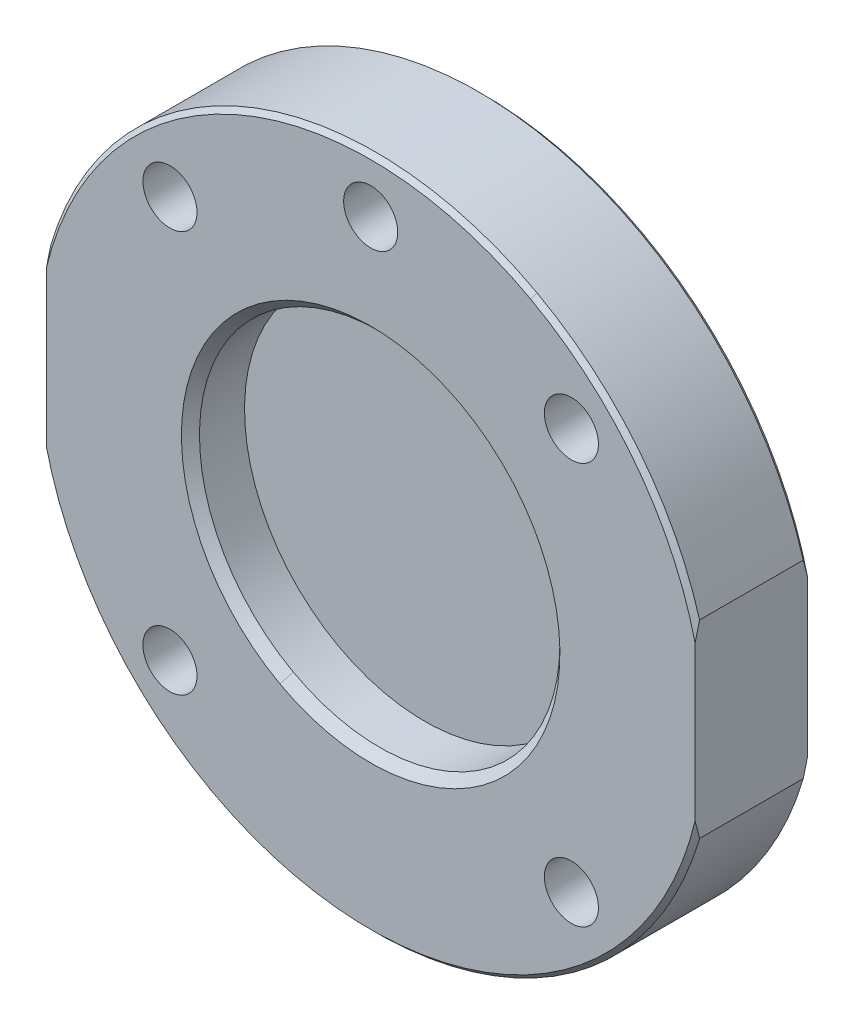
ISO-10303-21;
HEADER;
FILE_DESCRIPTION(('STEP AP214'),'2;1');
FILE_NAME('part.step','',(''),(''),'','','');
FILE_SCHEMA(('AUTOMOTIVE_DESIGN { 1 0 10303 214 1 1 1 1 }'));
ENDSEC;
DATA;
#1=APPLICATION_CONTEXT('core data for automotive mechanical design processes');
#2=APPLICATION_PROTOCOL_DEFINITION('international standard','automotive_design',2000,#1);
#3=PRODUCT_CONTEXT('',#1,'mechanical');
#4=PRODUCT('Part','Part','',(#3));
#5=PRODUCT_RELATED_PRODUCT_CATEGORY('part','',(#4));
#6=PRODUCT_DEFINITION_FORMATION('','',#4);
#7=PRODUCT_DEFINITION_CONTEXT('part definition',#1,'design');
#8=PRODUCT_DEFINITION('design','',#6,#7);
#9=PRODUCT_DEFINITION_SHAPE('','',#8);
#10=(LENGTH_UNIT() NAMED_UNIT(*) SI_UNIT(.MILLI.,.METRE.));
#11=(NAMED_UNIT(*) PLANE_ANGLE_UNIT() SI_UNIT($,.RADIAN.));
#12=(NAMED_UNIT(*) SI_UNIT($,.STERADIAN.) SOLID_ANGLE_UNIT());
#13=UNCERTAINTY_MEASURE_WITH_UNIT(LENGTH_MEASURE(1.E-05),#10,'distance_accuracy_value','');
#14=(GEOMETRIC_REPRESENTATION_CONTEXT(3) GLOBAL_UNCERTAINTY_ASSIGNED_CONTEXT((#13)) GLOBAL_UNIT_ASSIGNED_CONTEXT((#10,
#11,#12)) REPRESENTATION_CONTEXT('',''));
#15=CARTESIAN_POINT('',(0.,0.,0.));
#16=DIRECTION('',(0.,0.,1.));
#17=DIRECTION('',(1.,0.,0.));
#18=AXIS2_PLACEMENT_3D('',#15,#16,#17);
#19=CARTESIAN_POINT('',(-1.26431568645E-11,187.5,2135.));
#20=DIRECTION('',(0.,0.,-1.));
#21=DIRECTION('',(0.,1.,0.));
#22=AXIS2_PLACEMENT_3D('',#19,#20,#21);
#23=PLANE('',#22);
#24=CARTESIAN_POINT('',(-1.27996257736669E-11,150.,2135.));
#25=DIRECTION('',(0.,0.,-1.));
#26=DIRECTION('',(0.,1.,0.));
#27=AXIS2_PLACEMENT_3D('',#24,#25,#26);
#28=CIRCLE('',#27,37.0000000000614);
#29=CARTESIAN_POINT('',(-17.7387449868929,117.529445242013,2135.));
#30=VERTEX_POINT('',#29);
#31=CARTESIAN_POINT('',(-36.,141.455996254382,2135.));
#32=VERTEX_POINT('',#31);
#33=EDGE_CURVE('E236',#30,#32,#28,.T.);
#34=ORIENTED_EDGE('',*,*,#33,.F.);
#35=CARTESIAN_POINT('',(-1.28069309946663E-11,150.,2135.00000000005));
#36=DIRECTION('',(0.,0.,-1.));
#37=DIRECTION('',(-1.,0.,0.));
#38=AXIS2_PLACEMENT_3D('',#35,#36,#37);
#39=CIRCLE('',#38,36.9999999999653);
#40=CARTESIAN_POINT('',(36.,141.455996254935,2135.00000000006));
#41=VERTEX_POINT('',#40);
#42=EDGE_CURVE('E341',#41,#30,#39,.T.);
#43=ORIENTED_EDGE('',*,*,#42,.F.);
#44=DIRECTION('',(0.,1.,0.));
#45=VECTOR('',#44,1.);
#46=CARTESIAN_POINT('',(36.,203.876224518,2135.));
#47=LINE('',#46,#45);
#48=CARTESIAN_POINT('',(36.,158.544003745354,2135.));
#49=VERTEX_POINT('',#48);
#50=EDGE_CURVE('E235',#49,#41,#47,.F.);
#51=ORIENTED_EDGE('',*,*,#50,.F.);
#52=CARTESIAN_POINT('',(-1.2806930994673E-11,150.,2135.));
#53=DIRECTION('',(0.,0.,-1.));
#54=DIRECTION('',(-1.,0.,0.));
#55=AXIS2_PLACEMENT_3D('',#52,#53,#54);
#56=CIRCLE('',#55,37.0000000000291);
#57=CARTESIAN_POINT('',(17.7387449282676,182.470554789967,2135.00000000008));
#58=VERTEX_POINT('',#57);
#59=EDGE_CURVE('E96',#58,#49,#56,.T.);
#60=ORIENTED_EDGE('',*,*,#59,.F.);
#61=CARTESIAN_POINT('',(-1.27996257736651E-11,150.,2135.0000000001));
#62=DIRECTION('',(0.,0.,-1.));
#63=DIRECTION('',(0.,1.,0.));
#64=AXIS2_PLACEMENT_3D('',#61,#62,#63);
#65=CIRCLE('',#64,36.999999999946);
#66=CARTESIAN_POINT('',(-36.,158.544003745082,2135.00000000011));
#67=VERTEX_POINT('',#66);
#68=EDGE_CURVE('E332',#67,#58,#65,.T.);
#69=ORIENTED_EDGE('',*,*,#68,.F.);
#70=DIRECTION('',(0.,-1.,0.));
#71=VECTOR('',#70,1.);
#72=CARTESIAN_POINT('',(-36.,96.1237754822,2135.));
#73=LINE('',#72,#71);
#74=EDGE_CURVE('E192',#32,#67,#73,.F.);
#75=ORIENTED_EDGE('',*,*,#74,.F.);
#76=EDGE_LOOP('',(#34,#43,#51,#60,#69,#75));
#77=FACE_BOUND('',#76,.T.);
#78=CARTESIAN_POINT('',(-1.28109328700898E-11,150.,2135.00000000016));
#79=DIRECTION('',(0.,0.,1.));
#80=DIRECTION('',(1.,0.,0.));
#81=AXIS2_PLACEMENT_3D('',#78,#79,#80);
#82=CIRCLE('',#81,21.0000000000281);
#83=CARTESIAN_POINT('',(-10.0679370077922,131.570766581014,2135.0000000001));
#84=VERTEX_POINT('',#83);
#85=CARTESIAN_POINT('',(10.0679363106729,168.429233799812,2135.00000000016));
#86=VERTEX_POINT('',#85);
#87=EDGE_CURVE('E337',#84,#86,#82,.T.);
#88=ORIENTED_EDGE('',*,*,#87,.F.);
#89=CARTESIAN_POINT('',(-1.28076802635725E-11,150.,2135.0000000001));
#90=DIRECTION('',(0.,0.,1.));
#91=DIRECTION('',(1.,0.,0.));
#92=AXIS2_PLACEMENT_3D('',#89,#90,#91);
#93=CIRCLE('',#92,21.000000000097);
#94=EDGE_CURVE('E334',#86,#84,#93,.T.);
#95=ORIENTED_EDGE('',*,*,#94,.F.);
#96=EDGE_LOOP('',(#88,#95));
#97=FACE_BOUND('',#96,.T.);
#98=CARTESIAN_POINT('',(5.38149255679771E-12,181.5,2135.));
#99=DIRECTION('',(0.,0.,1.));
#100=DIRECTION('',(1.,0.,0.));
#101=AXIS2_PLACEMENT_3D('',#98,#99,#100);
#102=CIRCLE('',#101,3.);
#103=CARTESIAN_POINT('',(3.00000000000538,181.5,2135.));
#104=VERTEX_POINT('',#103);
#105=EDGE_CURVE('E350',#104,#104,#102,.T.);
#106=ORIENTED_EDGE('',*,*,#105,.F.);
#107=EDGE_LOOP('',(#106));
#108=FACE_BOUND('',#107,.T.);
#109=CARTESIAN_POINT('',(-22.2738636073891,172.273863607376,2135.));
#110=DIRECTION('',(0.,0.,1.));
#111=DIRECTION('',(1.,0.,0.));
#112=AXIS2_PLACEMENT_3D('',#109,#110,#111);
#113=CIRCLE('',#112,2.99999999999989);
#114=CARTESIAN_POINT('',(-19.2738636073892,172.273863607376,2135.));
#115=VERTEX_POINT('',#114);
#116=EDGE_CURVE('E354',#115,#115,#113,.T.);
#117=ORIENTED_EDGE('',*,*,#116,.F.);
#118=EDGE_LOOP('',(#117));
#119=FACE_BOUND('',#118,.T.);
#120=CARTESIAN_POINT('',(22.2738636073634,172.273863607376,2135.));
#121=DIRECTION('',(0.,0.,1.));
#122=DIRECTION('',(0.,-1.,0.));
#123=AXIS2_PLACEMENT_3D('',#120,#121,#122);
#124=CIRCLE('',#123,2.99999999999989);
#125=CARTESIAN_POINT('',(22.2738636073634,169.273863607377,2135.));
#126=VERTEX_POINT('',#125);
#127=EDGE_CURVE('E358',#126,#126,#124,.T.);
#128=ORIENTED_EDGE('',*,*,#127,.F.);
#129=EDGE_LOOP('',(#128));
#130=FACE_BOUND('',#129,.T.);
#131=CARTESIAN_POINT('',(22.2738636073635,127.726136392624,2135.));
#132=DIRECTION('',(0.,0.,1.));
#133=DIRECTION('',(0.,-1.,0.));
#134=AXIS2_PLACEMENT_3D('',#131,#132,#133);
#135=CIRCLE('',#134,2.99999999999989);
#136=CARTESIAN_POINT('',(22.2738636073635,124.726136392624,2135.));
#137=VERTEX_POINT('',#136);
#138=EDGE_CURVE('E371',#137,#137,#135,.T.);
#139=ORIENTED_EDGE('',*,*,#138,.F.);
#140=EDGE_LOOP('',(#139));
#141=FACE_BOUND('',#140,.T.);
#142=CARTESIAN_POINT('',(-22.2738636073892,127.726136392624,2135.));
#143=DIRECTION('',(0.,0.,1.));
#144=DIRECTION('',(0.,-1.,0.));
#145=AXIS2_PLACEMENT_3D('',#142,#143,#144);
#146=CIRCLE('',#145,2.99999999999989);
#147=CARTESIAN_POINT('',(-22.2738636073892,124.726136392624,2135.));
#148=VERTEX_POINT('',#147);
#149=EDGE_CURVE('E410',#148,#148,#146,.T.);
#150=ORIENTED_EDGE('',*,*,#149,.F.);
#151=EDGE_LOOP('',(#150));
#152=FACE_BOUND('',#151,.T.);
#153=ADVANCED_FACE('F17',(#77,#97,#108,#119,#130,#141,#152),#23,.F.);
#154=CARTESIAN_POINT('',(-1.27156329849E-11,170.,2129.));
#155=DIRECTION('',(0.,0.,-1.));
#156=DIRECTION('',(0.,1.,0.));
#157=AXIS2_PLACEMENT_3D('',#154,#155,#156);
#158=PLANE('',#157);
#159=CARTESIAN_POINT('',(-1.28025326172467E-11,150.,2129.));
#160=DIRECTION('',(0.,0.,-1.));
#161=DIRECTION('',(0.,1.,0.));
#162=AXIS2_PLACEMENT_3D('',#159,#160,#161);
#163=CIRCLE('',#162,20.);
#164=CARTESIAN_POINT('',(-1.28025326172467E-11,170.,2129.));
#165=VERTEX_POINT('',#164);
#166=EDGE_CURVE('E272',#165,#165,#163,.F.);
#167=ORIENTED_EDGE('',*,*,#166,.T.);
#168=EDGE_LOOP('',(#167));
#169=FACE_BOUND('',#168,.T.);
#170=ADVANCED_FACE('F19',(#169),#158,.F.);
#171=CARTESIAN_POINT('',(-1.28031627686E-11,150.,2128.75));
#172=DIRECTION('',(0.,0.,-1.));
#173=DIRECTION('',(0.,1.,0.));
#174=AXIS2_PLACEMENT_3D('',#171,#172,#173);
#175=CYLINDRICAL_SURFACE('',#174,20.);
#176=ORIENTED_EDGE('',*,*,#166,.F.);
#177=EDGE_LOOP('',(#176));
#178=FACE_BOUND('',#177,.T.);
#179=CARTESIAN_POINT('',(-1.27997918816526E-11,150.,2134.00000000007));
#180=DIRECTION('',(0.,0.,1.));
#181=DIRECTION('',(-0.150254927181628,-0.988647286375502,0.));
#182=AXIS2_PLACEMENT_3D('',#179,#180,#181);
#183=CIRCLE('',#182,20.0000000000519);
#184=CARTESIAN_POINT('',(9.58851077201447,167.551651237872,2134.00000000006));
#185=VERTEX_POINT('',#184);
#186=CARTESIAN_POINT('',(-9.58851077203576,132.448348762118,2134.00000000007));
#187=VERTEX_POINT('',#186);
#188=EDGE_CURVE('E256',#185,#187,#183,.T.);
#189=ORIENTED_EDGE('',*,*,#188,.T.);
#190=CARTESIAN_POINT('',(-1.27997918816294E-11,150.,2134.00000000013));
#191=DIRECTION('',(0.,0.,1.));
#192=DIRECTION('',(0.479425538605568,0.877582561889627,0.));
#193=AXIS2_PLACEMENT_3D('',#190,#191,#192);
#194=CIRCLE('',#193,20.0000000000421);
#195=EDGE_CURVE('E268',#187,#185,#194,.T.);
#196=ORIENTED_EDGE('',*,*,#195,.T.);
#197=EDGE_LOOP('',(#189,#196));
#198=FACE_BOUND('',#197,.T.);
#199=ADVANCED_FACE('F466',(#178,#198),#175,.F.);
#200=CARTESIAN_POINT('',(-1.28109328700887E-11,150.,2135.0000000001));
#201=DIRECTION('',(0.,0.,1.));
#202=DIRECTION('',(1.,0.,0.));
#203=AXIS2_PLACEMENT_3D('',#200,#201,#202);
#204=CONICAL_SURFACE('',#203,20.9999999999712,0.785398163387295);
#205=ORIENTED_EDGE('',*,*,#195,.F.);
#206=CARTESIAN_POINT('',(-9.58851077180505,132.448348762259,2133.99999999967));
#207=CARTESIAN_POINT('',(-9.60848686358083,132.41178283731,2134.04166666636));
#208=CARTESIAN_POINT('',(-9.62846295552438,132.375216912441,2134.08333333303));
#209=CARTESIAN_POINT('',(-9.66841513977023,132.302085062857,2134.1666666664));
#210=CARTESIAN_POINT('',(-9.68839123207254,132.265519138141,2134.20833333309));
#211=CARTESIAN_POINT('',(-9.72834341703227,132.192387288905,2134.29166666647));
#212=CARTESIAN_POINT('',(-9.74831950968968,132.155821364385,2134.33333333317));
#213=CARTESIAN_POINT('',(-9.78827169532161,132.082689515563,2134.41666666652));
#214=CARTESIAN_POINT('',(-9.80824778829613,132.046123591262,2134.45833333318));
#215=CARTESIAN_POINT('',(-9.84819997462057,131.972991742813,2134.54166666653));
#216=CARTESIAN_POINT('',(-9.8681760679705,131.936425818666,2134.58333333321));
#217=CARTESIAN_POINT('',(-9.90812825499771,131.863293970586,2134.66666666661));
#218=CARTESIAN_POINT('',(-9.928104348675,131.826728046653,2134.70833333331));
#219=CARTESIAN_POINT('',(-9.96805653638615,131.753596198946,2134.7916666667));
#220=CARTESIAN_POINT('',(-9.98803263042,131.717030275173,2134.83333333339));
#221=CARTESIAN_POINT('',(-10.0279848188205,131.64389842785,2134.91666666674));
#222=CARTESIAN_POINT('',(-10.0479609131872,131.607332504302,2134.95833333341));
#223=CARTESIAN_POINT('',(-10.0679370077242,131.570766580869,2135.0000000001));
#224=B_SPLINE_CURVE_WITH_KNOTS('',3,(#206,#207,#208,#209,#210,#211,#212,#213,#214,#215,#216,
#217,#218,#219,#220,#221,#222,#223),.UNSPECIFIED.,.F.,.F.,(4,2,2,2,2,2,2,2,4),(0.,
0.17677669530433,0.353553390728328,0.530330086153817,0.707106781416434,0.883883476841935,
1.06066017222619,1.23743686765018,1.41421356295451),.UNSPECIFIED.);
#225=EDGE_CURVE('E255',#187,#84,#224,.T.);
#226=ORIENTED_EDGE('',*,*,#225,.T.);
#227=ORIENTED_EDGE('',*,*,#87,.T.);
#228=DIRECTION('',(-0.339005049417269,-0.620544580565485,-0.707106781186831));
#229=VECTOR('',#228,1.);
#230=CARTESIAN_POINT('',(238219.838172141,436208.48884851,499000.));
#231=LINE('',#230,#229);
#232=EDGE_CURVE('E260',#86,#185,#231,.T.);
#233=ORIENTED_EDGE('',*,*,#232,.T.);
#234=EDGE_LOOP('',(#205,#226,#227,#233));
#235=FACE_BOUND('',#234,.T.);
#236=ADVANCED_FACE('F472',(#235),#204,.F.);
#237=CARTESIAN_POINT('',(-1.28076802635713E-11,150.,2135.));
#238=DIRECTION('',(0.,0.,1.));
#239=DIRECTION('',(1.,0.,0.));
#240=AXIS2_PLACEMENT_3D('',#237,#238,#239);
#241=CONICAL_SURFACE('',#240,20.9999999999824,0.785398163402658);
#242=ORIENTED_EDGE('',*,*,#188,.F.);
#243=ORIENTED_EDGE('',*,*,#232,.F.);
#244=ORIENTED_EDGE('',*,*,#94,.T.);
#245=ORIENTED_EDGE('',*,*,#225,.F.);
#246=EDGE_LOOP('',(#242,#243,#244,#245));
#247=FACE_BOUND('',#246,.T.);
#248=ADVANCED_FACE('F242',(#247),#241,.F.);
#249=CARTESIAN_POINT('',(-1.28213412109446E-11,150.,2134.49999999989));
#250=DIRECTION('',(0.,0.,-1.));
#251=DIRECTION('',(-1.,0.,0.));
#252=AXIS2_PLACEMENT_3D('',#249,#250,#251);
#253=CONICAL_SURFACE('',#252,37.5000000000957,0.785398163368873);
#254=CARTESIAN_POINT('',(-1.27886692874751E-11,150.,2134.5));
#255=DIRECTION('',(0.,0.,-1.));
#256=DIRECTION('',(0.,1.,0.));
#257=AXIS2_PLACEMENT_3D('',#254,#255,#256);
#258=CIRCLE('',#257,37.5);
#259=CARTESIAN_POINT('',(36.,139.500000014021,2134.5000000039));
#260=VERTEX_POINT('',#259);
#261=CARTESIAN_POINT('',(-17.9784576976579,117.090653929077,2134.5));
#262=VERTEX_POINT('',#261);
#263=EDGE_CURVE('E314',#260,#262,#258,.T.);
#264=ORIENTED_EDGE('',*,*,#263,.F.);
#265=CARTESIAN_POINT('',(35.9999999999904,141.455996254986,2135.00000000006));
#266=CARTESIAN_POINT('',(35.9999999999963,141.292043221371,2134.96214030547));
#267=CARTESIAN_POINT('',(35.9999999999988,141.128316864479,2134.92330095197));
#268=CARTESIAN_POINT('',(36.0000000000006,140.801352830876,2134.84370882591));
#269=CARTESIAN_POINT('',(36.,140.638115092221,2134.80295630786));
#270=CARTESIAN_POINT('',(35.9999999999994,140.312120610517,2134.71957381175));
#271=CARTESIAN_POINT('',(35.9999999999996,140.14936386601,2134.67694383938));
#272=CARTESIAN_POINT('',(35.9999999999999,139.824320782356,2134.58984194787));
#273=CARTESIAN_POINT('',(36.0000000000001,139.662034508484,2134.5453697851));
#274=CARTESIAN_POINT('',(36.,139.500000019499,2134.50000000543));
#275=B_SPLINE_CURVE_WITH_KNOTS('',3,(#265,#266,#267,#268,#269,#270,#271,#272,#273,#274),
.UNSPECIFIED.,.F.,.F.,(4,2,2,2,4),(0.,0.504798877370879,1.00953079000169,1.51426117073081,
2.01905851607456),.UNSPECIFIED.);
#276=EDGE_CURVE('E228',#41,#260,#275,.T.);
#277=ORIENTED_EDGE('',*,*,#276,.F.);
#278=ORIENTED_EDGE('',*,*,#42,.T.);
#279=CARTESIAN_POINT('',(-17.9784576976678,117.090653929236,2134.50000000017));
#280=CARTESIAN_POINT('',(-17.9684696680822,117.108936900613,2134.52083333349));
#281=CARTESIAN_POINT('',(-17.9584816385016,117.127219871989,2134.54166666681));
#282=CARTESIAN_POINT('',(-17.9385055793367,117.163785814736,2134.58333333345));
#283=CARTESIAN_POINT('',(-17.9285175497524,117.182068786109,2134.60416666677));
#284=CARTESIAN_POINT('',(-17.9085414905471,117.218634728886,2134.64583333344));
#285=CARTESIAN_POINT('',(-17.8985534609262,117.236917700291,2134.66666666679));
#286=CARTESIAN_POINT('',(-17.8785774017085,117.27348364305,2134.70833333349));
#287=CARTESIAN_POINT('',(-17.8685893721117,117.291766614404,2134.72916666684));
#288=CARTESIAN_POINT('',(-17.8486133128992,117.328332557127,2134.77083333348));
#289=CARTESIAN_POINT('',(-17.8386252832836,117.346615528495,2134.79166666677));
#290=CARTESIAN_POINT('',(-17.8186492240268,117.383181471249,2134.83333333341));
#291=CARTESIAN_POINT('',(-17.8086611943856,117.401464442636,2134.85416666677));
#292=CARTESIAN_POINT('',(-17.7886851351252,117.438030385349,2134.89583333345));
#293=CARTESIAN_POINT('',(-17.7786971055059,117.456313356676,2134.91666666678));
#294=CARTESIAN_POINT('',(-17.7587210462424,117.49287929936,2134.95833333343));
#295=CARTESIAN_POINT('',(-17.7487330165981,117.511162270717,2134.97916666675));
#296=CARTESIAN_POINT('',(-17.7387449869384,117.529445242096,2135.00000000005));
#297=B_SPLINE_CURVE_WITH_KNOTS('',3,(#279,#280,#281,#282,#283,#284,#285,#286,#287,#288,#289,
#290,#291,#292,#293,#294,#295,#296),.UNSPECIFIED.,.F.,.F.,(4,2,2,2,2,2,2,2,4),(0.,
0.0883883475912603,0.176776695180806,0.265165042933382,0.353553390563143,0.441941738112498,
0.530330085865078,0.61871843341501,0.70710678104588),.UNSPECIFIED.);
#298=EDGE_CURVE('E298',#262,#30,#297,.T.);
#299=ORIENTED_EDGE('',*,*,#298,.F.);
#300=EDGE_LOOP('',(#264,#277,#278,#299));
#301=FACE_BOUND('',#300,.T.);
#302=ADVANCED_FACE('F238',(#301),#253,.T.);
#303=CARTESIAN_POINT('',(-1.28213412109446E-11,150.,2134.50000000006));
#304=DIRECTION('',(0.,0.,-1.));
#305=DIRECTION('',(-1.,0.,0.));
#306=AXIS2_PLACEMENT_3D('',#303,#304,#305);
#307=CONICAL_SURFACE('',#306,37.4999999999687,0.78539816341238);
#308=ORIENTED_EDGE('',*,*,#59,.T.);
#309=CARTESIAN_POINT('',(35.9999999999313,160.500000014835,2134.49999999583));
#310=CARTESIAN_POINT('',(35.9999999999751,160.337965523028,2134.54536977644));
#311=CARTESIAN_POINT('',(35.9999999999932,160.175679246323,2134.58984194012));
#312=CARTESIAN_POINT('',(36.0000000000065,159.850636156982,2134.67694383336));
#313=CARTESIAN_POINT('',(36.0000000000017,159.687879409622,2134.71957380655));
#314=CARTESIAN_POINT('',(35.9999999999979,159.361884922195,2134.80295630426));
#315=CARTESIAN_POINT('',(35.9999999999988,159.19864718067,2134.84370882307));
#316=CARTESIAN_POINT('',(36.0000000000008,158.87168314131,2134.9233009506));
#317=CARTESIAN_POINT('',(36.0000000000018,158.70795678153,2134.9621403048));
#318=CARTESIAN_POINT('',(36.,158.544003745021,2135.00000000007));
#319=B_SPLINE_CURVE_WITH_KNOTS('',3,(#309,#310,#311,#312,#313,#314,#315,#316,#317,#318),
.UNSPECIFIED.,.F.,.F.,(4,2,2,2,4),(0.,0.504797354257133,1.00952774389577,1.51425966543595,
2.01905855172013),.UNSPECIFIED.);
#320=CARTESIAN_POINT('',(36.,160.500000007344,2134.49999999796));
#321=VERTEX_POINT('',#320);
#322=EDGE_CURVE('E206',#321,#49,#319,.T.);
#323=ORIENTED_EDGE('',*,*,#322,.F.);
#324=CARTESIAN_POINT('',(-1.28214638342133E-11,150.,2134.50000000006));
#325=DIRECTION('',(0.,0.,-1.));
#326=DIRECTION('',(0.479425538604406,0.877582561890262,0.));
#327=AXIS2_PLACEMENT_3D('',#324,#325,#326);
#328=CIRCLE('',#327,37.4999999999687);
#329=CARTESIAN_POINT('',(17.9784576976027,182.909346070941,2134.5));
#330=VERTEX_POINT('',#329);
#331=EDGE_CURVE('E102',#321,#330,#328,.F.);
#332=ORIENTED_EDGE('',*,*,#331,.T.);
#333=DIRECTION('',(-0.339005049419751,-0.62054458056411,0.707106781186848));
#334=VECTOR('',#333,1.);
#335=CARTESIAN_POINT('',(240274.656032335,439969.807707812,-499000.00000002));
#336=LINE('',#335,#334);
#337=EDGE_CURVE('E310',#58,#330,#336,.F.);
#338=ORIENTED_EDGE('',*,*,#337,.F.);
#339=EDGE_LOOP('',(#308,#323,#332,#338));
#340=FACE_BOUND('',#339,.T.);
#341=ADVANCED_FACE('F181',(#340),#307,.T.);
#342=CARTESIAN_POINT('',(-1.28074634231368E-11,150.,2134.50000000006));
#343=DIRECTION('',(0.,0.,-1.));
#344=DIRECTION('',(0.,1.,0.));
#345=AXIS2_PLACEMENT_3D('',#342,#343,#344);
#346=CONICAL_SURFACE('',#345,37.4999999999327,0.78539816333901);
#347=CARTESIAN_POINT('',(-1.27886692874751E-11,150.,2134.5));
#348=DIRECTION('',(0.,0.,-1.));
#349=DIRECTION('',(0.,1.,0.));
#350=AXIS2_PLACEMENT_3D('',#347,#348,#349);
#351=CIRCLE('',#350,37.5);
#352=CARTESIAN_POINT('',(-36.,160.499999910522,2134.50000002506));
#353=VERTEX_POINT('',#352);
#354=EDGE_CURVE('E299',#353,#330,#351,.T.);
#355=ORIENTED_EDGE('',*,*,#354,.F.);
#356=CARTESIAN_POINT('',(-35.9999999999806,158.544003745025,2135.00000000012));
#357=CARTESIAN_POINT('',(-35.9999999999928,158.707956769775,2134.96214030757));
#358=CARTESIAN_POINT('',(-35.9999999999979,158.871683117828,2134.92330095622));
#359=CARTESIAN_POINT('',(-36.0000000000016,159.198647133805,2134.84370883467));
#360=CARTESIAN_POINT('',(-36.0000000000003,159.361884863674,2134.80295631897));
#361=CARTESIAN_POINT('',(-35.9999999999992,159.687879327859,2134.71957382777));
#362=CARTESIAN_POINT('',(-35.9999999999994,159.850636063634,2134.67694385796));
#363=CARTESIAN_POINT('',(-36.,160.175679129875,2134.58984197175));
#364=CARTESIAN_POINT('',(-36.0000000000003,160.337965395065,2134.54536981173));
#365=CARTESIAN_POINT('',(-36.,160.499999875398,2134.5000000349));
#366=B_SPLINE_CURVE_WITH_KNOTS('',3,(#356,#357,#358,#359,#360,#361,#362,#363,#364,#365),
.UNSPECIFIED.,.F.,.F.,(4,2,2,2,4),(0.,0.504798850078364,1.00953073542713,1.51426108887424,
2.01905840692561),.UNSPECIFIED.);
#367=EDGE_CURVE('E185',#67,#353,#366,.T.);
#368=ORIENTED_EDGE('',*,*,#367,.F.);
#369=ORIENTED_EDGE('',*,*,#68,.T.);
#370=ORIENTED_EDGE('',*,*,#337,.T.);
#371=EDGE_LOOP('',(#355,#368,#369,#370));
#372=FACE_BOUND('',#371,.T.);
#373=ADVANCED_FACE('F176',(#372),#346,.T.);
#374=CARTESIAN_POINT('',(-1.28031627686E-11,150.,2128.75));
#375=DIRECTION('',(0.,0.,-1.));
#376=DIRECTION('',(0.,1.,0.));
#377=AXIS2_PLACEMENT_3D('',#374,#375,#376);
#378=CYLINDRICAL_SURFACE('',#377,37.5);
#379=CARTESIAN_POINT('',(-1.27990725576457E-11,150.,2123.00000000005));
#380=DIRECTION('',(0.,0.,1.));
#381=DIRECTION('',(-0.387538340341674,-0.921853586403622,0.));
#382=AXIS2_PLACEMENT_3D('',#379,#380,#381);
#383=CIRCLE('',#382,37.4999999999215);
#384=CARTESIAN_POINT('',(-36.,160.499999910485,2123.00000000008));
#385=VERTEX_POINT('',#384);
#386=CARTESIAN_POINT('',(17.9784576976092,182.909346070913,2123.00000000007));
#387=VERTEX_POINT('',#386);
#388=EDGE_CURVE('E124',#385,#387,#383,.F.);
#389=ORIENTED_EDGE('',*,*,#388,.F.);
#390=DIRECTION('',(0.,0.,1.));
#391=VECTOR('',#390,1.);
#392=CARTESIAN_POINT('',(-36.,160.499999821,2135.));
#393=LINE('',#392,#391);
#394=EDGE_CURVE('E191',#353,#385,#393,.F.);
#395=ORIENTED_EDGE('',*,*,#394,.F.);
#396=ORIENTED_EDGE('',*,*,#354,.T.);
#397=ORIENTED_EDGE('',*,*,#331,.F.);
#398=DIRECTION('',(0.,0.,1.));
#399=VECTOR('',#398,1.);
#400=CARTESIAN_POINT('',(36.,160.5,2135.));
#401=LINE('',#400,#399);
#402=CARTESIAN_POINT('',(36.,160.500000000062,2123.00000000009));
#403=VERTEX_POINT('',#402);
#404=EDGE_CURVE('E226',#403,#321,#401,.T.);
#405=ORIENTED_EDGE('',*,*,#404,.F.);
#406=CARTESIAN_POINT('',(-1.27919671302821E-11,150.,2123.00000000011));
#407=DIRECTION('',(0.,0.,1.));
#408=DIRECTION('',(0.479425538604921,0.87758256188998,0.));
#409=AXIS2_PLACEMENT_3D('',#406,#407,#408);
#410=CIRCLE('',#409,37.5000000000469);
#411=EDGE_CURVE('E127',#387,#403,#410,.F.);
#412=ORIENTED_EDGE('',*,*,#411,.F.);
#413=EDGE_LOOP('',(#389,#395,#396,#397,#405,#412));
#414=FACE_BOUND('',#413,.T.);
#415=ADVANCED_FACE('F172',(#414),#378,.T.);
#416=CARTESIAN_POINT('',(-1.28031627686E-11,150.,2128.75));
#417=DIRECTION('',(0.,0.,-1.));
#418=DIRECTION('',(0.,1.,0.));
#419=AXIS2_PLACEMENT_3D('',#416,#417,#418);
#420=CYLINDRICAL_SURFACE('',#419,37.5);
#421=CARTESIAN_POINT('',(-1.2807252979495E-11,150.,2134.5));
#422=DIRECTION('',(0.,0.,-1.));
#423=DIRECTION('',(-0.169024757919009,-0.985611805535232,0.));
#424=AXIS2_PLACEMENT_3D('',#421,#422,#423);
#425=CIRCLE('',#424,37.5000000000472);
#426=CARTESIAN_POINT('',(-36.,139.499999890577,2134.49999996937));
#427=VERTEX_POINT('',#426);
#428=EDGE_CURVE('E295',#427,#262,#425,.F.);
#429=ORIENTED_EDGE('',*,*,#428,.F.);
#430=DIRECTION('',(0.,0.,1.));
#431=VECTOR('',#430,1.);
#432=CARTESIAN_POINT('',(-36.,139.5,2135.));
#433=LINE('',#432,#431);
#434=CARTESIAN_POINT('',(-36.,139.500000000005,2123.00000000011));
#435=VERTEX_POINT('',#434);
#436=EDGE_CURVE('E142',#435,#427,#433,.T.);
#437=ORIENTED_EDGE('',*,*,#436,.F.);
#438=CARTESIAN_POINT('',(-1.27990725576466E-11,150.,2123.00000000011));
#439=DIRECTION('',(0.,0.,1.));
#440=DIRECTION('',(-0.387538340341776,-0.921853586403579,0.));
#441=AXIS2_PLACEMENT_3D('',#438,#439,#440);
#442=CIRCLE('',#441,37.499999999985);
#443=CARTESIAN_POINT('',(36.,139.500000014051,2122.99999999614));
#444=VERTEX_POINT('',#443);
#445=EDGE_CURVE('E205',#444,#435,#442,.F.);
#446=ORIENTED_EDGE('',*,*,#445,.F.);
#447=DIRECTION('',(0.,0.,1.));
#448=VECTOR('',#447,1.);
#449=CARTESIAN_POINT('',(36.,139.500000028,2135.));
#450=LINE('',#449,#448);
#451=EDGE_CURVE('E227',#260,#444,#450,.F.);
#452=ORIENTED_EDGE('',*,*,#451,.F.);
#453=ORIENTED_EDGE('',*,*,#263,.T.);
#454=EDGE_LOOP('',(#429,#437,#446,#452,#453));
#455=FACE_BOUND('',#454,.T.);
#456=ADVANCED_FACE('F165',(#455),#420,.T.);
#457=CARTESIAN_POINT('',(-1.28074634231368E-11,150.,2134.50000000006));
#458=DIRECTION('',(0.,0.,-1.));
#459=DIRECTION('',(0.,1.,0.));
#460=AXIS2_PLACEMENT_3D('',#457,#458,#459);
#461=CONICAL_SURFACE('',#460,37.4999999999327,0.785398163337427);
#462=ORIENTED_EDGE('',*,*,#33,.T.);
#463=CARTESIAN_POINT('',(-35.9999999991242,139.499999781258,2134.49999993836));
#464=CARTESIAN_POINT('',(-35.9999999996836,139.662034289796,2134.54536972471));
#465=CARTESIAN_POINT('',(-35.9999999999147,139.824320583323,2134.58984189382));
#466=CARTESIAN_POINT('',(-36.0000000000849,140.149363706438,2134.67694379743));
#467=CARTESIAN_POINT('',(-36.0000000000241,140.312120470751,2134.71957377557));
#468=CARTESIAN_POINT('',(-35.9999999999755,140.638114992178,2134.8029562828));
#469=CARTESIAN_POINT('',(-35.9999999999876,140.801352750751,2134.8437088062));
#470=CARTESIAN_POINT('',(-36.000000000012,141.128316824313,2134.9233009425));
#471=CARTESIAN_POINT('',(-36.0000000000242,141.292043201247,2134.96214030089));
#472=CARTESIAN_POINT('',(-36.,141.455996254963,2135.00000000013));
#473=B_SPLINE_CURVE_WITH_KNOTS('',3,(#463,#464,#465,#466,#467,#468,#469,#470,#471,#472),
.UNSPECIFIED.,.F.,.F.,(4,2,2,2,4),(0.,0.504797407230878,1.0095278498208,1.51425982430982,
2.01905876356534),.UNSPECIFIED.);
#474=EDGE_CURVE('E139',#427,#32,#473,.T.);
#475=ORIENTED_EDGE('',*,*,#474,.F.);
#476=ORIENTED_EDGE('',*,*,#428,.T.);
#477=ORIENTED_EDGE('',*,*,#298,.T.);
#478=EDGE_LOOP('',(#462,#475,#476,#477));
#479=FACE_BOUND('',#478,.T.);
#480=ADVANCED_FACE('F160',(#479),#461,.T.);
#481=CARTESIAN_POINT('',(-1.27987898057569E-11,150.,2123.00000000005));
#482=DIRECTION('',(0.,0.,1.));
#483=DIRECTION('',(1.,0.,0.));
#484=AXIS2_PLACEMENT_3D('',#481,#482,#483);
#485=CONICAL_SURFACE('',#484,37.4999999999215,0.785398163420506);
#486=DIRECTION('',(-0.339005049420935,-0.620544580563482,-0.707106781186832));
#487=VECTOR('',#486,1.);
#488=CARTESIAN_POINT('',(238233.501802565,436233.499950113,499000.));
#489=LINE('',#488,#487);
#490=CARTESIAN_POINT('',(17.7387449283911,182.470554789982,2122.50000000014));
#491=VERTEX_POINT('',#490);
#492=EDGE_CURVE('E117',#491,#387,#489,.F.);
#493=ORIENTED_EDGE('',*,*,#492,.F.);
#494=CARTESIAN_POINT('',(-1.27906021011437E-11,150.,2122.5000000002));
#495=DIRECTION('',(0.,0.,1.));
#496=DIRECTION('',(1.,0.,0.));
#497=AXIS2_PLACEMENT_3D('',#494,#495,#496);
#498=CIRCLE('',#497,37.0000000000523);
#499=CARTESIAN_POINT('',(-36.,158.5440037453,2122.50000000013));
#500=VERTEX_POINT('',#499);
#501=EDGE_CURVE('E122',#500,#491,#498,.F.);
#502=ORIENTED_EDGE('',*,*,#501,.F.);
#503=CARTESIAN_POINT('',(-36.0000000000049,160.49999999997,2123.0000000001));
#504=CARTESIAN_POINT('',(-36.0000000000016,160.337965509381,2122.95463021991));
#505=CARTESIAN_POINT('',(-36.0000000000002,160.1756792339,2122.91015805663));
#506=CARTESIAN_POINT('',(-35.9999999999992,159.850636147018,2122.82305616415));
#507=CARTESIAN_POINT('',(-35.9999999999996,159.687879400892,2122.78042619132));
#508=CARTESIAN_POINT('',(-35.9999999999999,159.361884915941,2122.6970436943));
#509=CARTESIAN_POINT('',(-35.9999999999998,159.198647175657,2122.65629117582));
#510=CARTESIAN_POINT('',(-35.9999999999997,158.871683138788,2122.57669904894));
#511=CARTESIAN_POINT('',(-35.9999999999997,158.707956780257,2122.53785969504));
#512=CARTESIAN_POINT('',(-36.,158.544003745001,2122.50000000006));
#513=B_SPLINE_CURVE_WITH_KNOTS('',3,(#503,#504,#505,#506,#507,#508,#509,#510,#511,#512),
.UNSPECIFIED.,.F.,.F.,(4,2,2,2,4),(0.,0.504797350399535,1.00952773618245,1.51425965386692,
2.01905853629366),.UNSPECIFIED.);
#514=EDGE_CURVE('E193',#385,#500,#513,.T.);
#515=ORIENTED_EDGE('',*,*,#514,.F.);
#516=ORIENTED_EDGE('',*,*,#388,.T.);
#517=EDGE_LOOP('',(#493,#502,#515,#516));
#518=FACE_BOUND('',#517,.T.);
#519=ADVANCED_FACE('F119',(#518),#485,.T.);
#520=CARTESIAN_POINT('',(-1.2791850911853E-11,150.,2123.00000000011));
#521=DIRECTION('',(0.,0.,1.));
#522=DIRECTION('',(0.,-1.,0.));
#523=AXIS2_PLACEMENT_3D('',#520,#521,#522);
#524=CONICAL_SURFACE('',#523,37.5000000000469,0.785398163439047);
#525=ORIENTED_EDGE('',*,*,#492,.T.);
#526=ORIENTED_EDGE('',*,*,#411,.T.);
#527=CARTESIAN_POINT('',(36.,158.544003744997,2122.50000000004));
#528=CARTESIAN_POINT('',(35.9999999999999,158.707956780255,2122.53785969501));
#529=CARTESIAN_POINT('',(35.9999999999998,158.871683138788,2122.57669904891));
#530=CARTESIAN_POINT('',(35.9999999999998,159.198647175661,2122.6562911758));
#531=CARTESIAN_POINT('',(35.9999999999998,159.361884915947,2122.69704369428));
#532=CARTESIAN_POINT('',(35.9999999999998,159.687879400903,2122.78042619129));
#533=CARTESIAN_POINT('',(35.9999999999998,159.85063614703,2122.82305616412));
#534=CARTESIAN_POINT('',(35.9999999999998,160.175679233916,2122.9101580566));
#535=CARTESIAN_POINT('',(35.9999999999999,160.337965509399,2122.95463021988));
#536=CARTESIAN_POINT('',(36.,160.499999999991,2123.00000000007));
#537=B_SPLINE_CURVE_WITH_KNOTS('',3,(#527,#528,#529,#530,#531,#532,#533,#534,#535,#536),
.UNSPECIFIED.,.F.,.F.,(4,2,2,2,4),(0.,0.504798882432072,1.00953080012207,1.51426118591026,
2.01905853631529),.UNSPECIFIED.);
#538=CARTESIAN_POINT('',(36.,158.544003745087,2122.50000000006));
#539=VERTEX_POINT('',#538);
#540=EDGE_CURVE('E133',#539,#403,#537,.T.);
#541=ORIENTED_EDGE('',*,*,#540,.F.);
#542=CARTESIAN_POINT('',(-1.28046011402648E-11,150.,2122.50000000008));
#543=DIRECTION('',(0.,0.,1.));
#544=DIRECTION('',(0.,-1.,0.));
#545=AXIS2_PLACEMENT_3D('',#542,#543,#544);
#546=CIRCLE('',#545,36.9999999999803);
#547=EDGE_CURVE('E130',#491,#539,#546,.F.);
#548=ORIENTED_EDGE('',*,*,#547,.F.);
#549=EDGE_LOOP('',(#525,#526,#541,#548));
#550=FACE_BOUND('',#549,.T.);
#551=ADVANCED_FACE('F131',(#550),#524,.T.);
#552=CARTESIAN_POINT('',(36.,203.876224518,2135.));
#553=DIRECTION('',(1.,0.,0.));
#554=DIRECTION('',(0.,1.,0.));
#555=AXIS2_PLACEMENT_3D('',#552,#553,#554);
#556=PLANE('',#555);
#557=ORIENTED_EDGE('',*,*,#404,.T.);
#558=ORIENTED_EDGE('',*,*,#322,.T.);
#559=ORIENTED_EDGE('',*,*,#50,.T.);
#560=ORIENTED_EDGE('',*,*,#276,.T.);
#561=ORIENTED_EDGE('',*,*,#451,.T.);
#562=CARTESIAN_POINT('',(36.,141.455996254997,2122.5));
#563=CARTESIAN_POINT('',(35.9999999999998,141.292043219742,2122.53785969499));
#564=CARTESIAN_POINT('',(35.9999999999998,141.128316861211,2122.57669904889));
#565=CARTESIAN_POINT('',(35.9999999999997,140.801352824339,2122.65629117578));
#566=CARTESIAN_POINT('',(35.9999999999997,140.638115084054,2122.69704369426));
#567=CARTESIAN_POINT('',(35.9999999999997,140.3121205991,2122.78042619128));
#568=CARTESIAN_POINT('',(35.9999999999997,140.149363852972,2122.82305616411));
#569=CARTESIAN_POINT('',(35.9999999999997,139.824320766088,2122.91015805659));
#570=CARTESIAN_POINT('',(35.9999999999998,139.662034490606,2122.95463021987));
#571=CARTESIAN_POINT('',(36.,139.500000000015,2123.00000000007));
#572=B_SPLINE_CURVE_WITH_KNOTS('',3,(#562,#563,#564,#565,#566,#567,#568,#569,#570,#571),
.UNSPECIFIED.,.F.,.F.,(4,2,2,2,4),(0.,0.504798882431321,1.0095308001204,1.51426118590792,
2.01905853631212),.UNSPECIFIED.);
#573=CARTESIAN_POINT('',(36.,141.455996254909,2122.50000000004));
#574=VERTEX_POINT('',#573);
#575=EDGE_CURVE('E197',#574,#444,#572,.T.);
#576=ORIENTED_EDGE('',*,*,#575,.F.);
#577=DIRECTION('',(0.,1.,0.));
#578=VECTOR('',#577,1.);
#579=CARTESIAN_POINT('',(36.,177.8,2122.5));
#580=LINE('',#579,#578);
#581=EDGE_CURVE('E135',#539,#574,#580,.F.);
#582=ORIENTED_EDGE('',*,*,#581,.F.);
#583=ORIENTED_EDGE('',*,*,#540,.T.);
#584=EDGE_LOOP('',(#557,#558,#559,#560,#561,#576,#582,#583));
#585=FACE_BOUND('',#584,.T.);
#586=ADVANCED_FACE('F212',(#585),#556,.T.);
#587=CARTESIAN_POINT('',(-1.27987898057569E-11,150.,2123.00000000005));
#588=DIRECTION('',(0.,0.,1.));
#589=DIRECTION('',(1.,0.,0.));
#590=AXIS2_PLACEMENT_3D('',#587,#588,#589);
#591=CONICAL_SURFACE('',#590,37.4999999999215,0.785398163420506);
#592=CARTESIAN_POINT('',(-36.0000000000096,141.45599625501,2122.50000000006));
#593=CARTESIAN_POINT('',(-36.0000000000033,141.292043219752,2122.53785969504));
#594=CARTESIAN_POINT('',(-36.0000000000007,141.12831686122,2122.57669904893));
#595=CARTESIAN_POINT('',(-35.9999999999988,140.801352824348,2122.65629117582));
#596=CARTESIAN_POINT('',(-35.9999999999995,140.638115084062,2122.6970436943));
#597=CARTESIAN_POINT('',(-36.0000000000001,140.312120599108,2122.78042619132));
#598=CARTESIAN_POINT('',(-35.9999999999999,140.14936385298,2122.82305616415));
#599=CARTESIAN_POINT('',(-35.9999999999997,139.824320766095,2122.91015805663));
#600=CARTESIAN_POINT('',(-35.9999999999996,139.662034490613,2122.95463021991));
#601=CARTESIAN_POINT('',(-36.,139.500000000022,2123.00000000011));
#602=B_SPLINE_CURVE_WITH_KNOTS('',3,(#592,#593,#594,#595,#596,#597,#598,#599,#600,#601),
.UNSPECIFIED.,.F.,.F.,(4,2,2,2,4),(0.,0.504798882431909,1.00953080012158,1.51426118590972,
2.01905853631426),.UNSPECIFIED.);
#603=CARTESIAN_POINT('',(-36.,141.455996255014,2122.50000000006));
#604=VERTEX_POINT('',#603);
#605=EDGE_CURVE('E151',#604,#435,#602,.T.);
#606=ORIENTED_EDGE('',*,*,#605,.F.);
#607=CARTESIAN_POINT('',(-1.28046011402653E-11,150.,2122.50000000006));
#608=DIRECTION('',(0.,0.,1.));
#609=DIRECTION('',(0.,-1.,0.));
#610=AXIS2_PLACEMENT_3D('',#607,#608,#609);
#611=CIRCLE('',#610,36.9999999999802);
#612=EDGE_CURVE('E27',#574,#604,#611,.F.);
#613=ORIENTED_EDGE('',*,*,#612,.F.);
#614=ORIENTED_EDGE('',*,*,#575,.T.);
#615=ORIENTED_EDGE('',*,*,#445,.T.);
#616=EDGE_LOOP('',(#606,#613,#614,#615));
#617=FACE_BOUND('',#616,.T.);
#618=ADVANCED_FACE('F216',(#617),#591,.T.);
#619=CARTESIAN_POINT('',(-36.,96.1237754822,2135.));
#620=DIRECTION('',(-1.,0.,0.));
#621=DIRECTION('',(0.,-1.,0.));
#622=AXIS2_PLACEMENT_3D('',#619,#620,#621);
#623=PLANE('',#622);
#624=ORIENTED_EDGE('',*,*,#436,.T.);
#625=ORIENTED_EDGE('',*,*,#474,.T.);
#626=ORIENTED_EDGE('',*,*,#74,.T.);
#627=ORIENTED_EDGE('',*,*,#367,.T.);
#628=ORIENTED_EDGE('',*,*,#394,.T.);
#629=ORIENTED_EDGE('',*,*,#514,.T.);
#630=DIRECTION('',(0.,1.,0.));
#631=VECTOR('',#630,1.);
#632=CARTESIAN_POINT('',(-36.,177.8,2122.5));
#633=LINE('',#632,#631);
#634=EDGE_CURVE('E11',#604,#500,#633,.T.);
#635=ORIENTED_EDGE('',*,*,#634,.F.);
#636=ORIENTED_EDGE('',*,*,#605,.T.);
#637=EDGE_LOOP('',(#624,#625,#626,#627,#628,#629,#635,#636));
#638=FACE_BOUND('',#637,.T.);
#639=ADVANCED_FACE('F157',(#638),#623,.T.);
#640=CARTESIAN_POINT('',(-1.26768032968E-11,177.8,2122.5));
#641=DIRECTION('',(0.,0.,-1.));
#642=DIRECTION('',(0.,1.,0.));
#643=AXIS2_PLACEMENT_3D('',#640,#641,#642);
#644=PLANE('',#643);
#645=CARTESIAN_POINT('',(-22.2738636073892,127.726136392624,2122.5));
#646=DIRECTION('',(0.,0.,-1.));
#647=DIRECTION('',(0.,1.,0.));
#648=AXIS2_PLACEMENT_3D('',#645,#646,#647);
#649=CIRCLE('',#648,2.5);
#650=CARTESIAN_POINT('',(-22.2738636073892,130.226136392624,2122.5));
#651=VERTEX_POINT('',#650);
#652=EDGE_CURVE('E21',#651,#651,#649,.T.);
#653=ORIENTED_EDGE('',*,*,#652,.F.);
#654=EDGE_LOOP('',(#653));
#655=FACE_BOUND('',#654,.T.);
#656=CARTESIAN_POINT('',(22.2738636073635,127.726136392623,2122.5));
#657=DIRECTION('',(0.,0.,-1.));
#658=DIRECTION('',(0.,1.,0.));
#659=AXIS2_PLACEMENT_3D('',#656,#657,#658);
#660=CIRCLE('',#659,2.5);
#661=CARTESIAN_POINT('',(22.2738636073635,130.226136392623,2122.5));
#662=VERTEX_POINT('',#661);
#663=EDGE_CURVE('E356',#662,#662,#660,.T.);
#664=ORIENTED_EDGE('',*,*,#663,.F.);
#665=EDGE_LOOP('',(#664));
#666=FACE_BOUND('',#665,.T.);
#667=CARTESIAN_POINT('',(22.2738636073634,172.273863607376,2122.5));
#668=DIRECTION('',(0.,0.,-1.));
#669=DIRECTION('',(0.,1.,0.));
#670=AXIS2_PLACEMENT_3D('',#667,#668,#669);
#671=CIRCLE('',#670,2.5);
#672=CARTESIAN_POINT('',(22.2738636073634,174.773863607376,2122.5));
#673=VERTEX_POINT('',#672);
#674=EDGE_CURVE('E352',#673,#673,#671,.T.);
#675=ORIENTED_EDGE('',*,*,#674,.F.);
#676=EDGE_LOOP('',(#675));
#677=FACE_BOUND('',#676,.T.);
#678=CARTESIAN_POINT('',(-22.2738636073891,172.273863607376,2122.5));
#679=DIRECTION('',(0.,0.,-1.));
#680=DIRECTION('',(0.,1.,0.));
#681=AXIS2_PLACEMENT_3D('',#678,#679,#680);
#682=CIRCLE('',#681,2.5);
#683=CARTESIAN_POINT('',(-22.2738636073891,174.773863607376,2122.5));
#684=VERTEX_POINT('',#683);
#685=EDGE_CURVE('E347',#684,#684,#682,.T.);
#686=ORIENTED_EDGE('',*,*,#685,.F.);
#687=EDGE_LOOP('',(#686));
#688=FACE_BOUND('',#687,.T.);
#689=ORIENTED_EDGE('',*,*,#612,.T.);
#690=ORIENTED_EDGE('',*,*,#634,.T.);
#691=ORIENTED_EDGE('',*,*,#501,.T.);
#692=ORIENTED_EDGE('',*,*,#547,.T.);
#693=ORIENTED_EDGE('',*,*,#581,.T.);
#694=EDGE_LOOP('',(#689,#690,#691,#692,#693));
#695=FACE_BOUND('',#694,.T.);
#696=ADVANCED_FACE('F137',(#655,#666,#677,#688,#695),#644,.T.);
#697=CARTESIAN_POINT('',(5.38149255679771E-12,181.5,2129.));
#698=DIRECTION('',(0.,0.,1.));
#699=DIRECTION('',(1.,0.,0.));
#700=AXIS2_PLACEMENT_3D('',#697,#698,#699);
#701=CONICAL_SURFACE('',#700,3.,1.02974425867657);
#702=CARTESIAN_POINT('',(5.37958147541844E-12,181.5,2127.19741814292));
#703=VERTEX_POINT('',#702);
#704=VERTEX_LOOP('',#703);
#705=FACE_BOUND('',#704,.T.);
#706=CARTESIAN_POINT('',(5.38149255679771E-12,181.5,2129.));
#707=DIRECTION('',(0.,0.,1.));
#708=DIRECTION('',(1.,0.,0.));
#709=AXIS2_PLACEMENT_3D('',#706,#707,#708);
#710=CIRCLE('',#709,3.);
#711=CARTESIAN_POINT('',(3.00000000000538,181.5,2129.));
#712=VERTEX_POINT('',#711);
#713=EDGE_CURVE('E346',#712,#712,#710,.T.);
#714=ORIENTED_EDGE('',*,*,#713,.T.);
#715=EDGE_LOOP('',(#714));
#716=FACE_BOUND('',#715,.T.);
#717=ADVANCED_FACE('F390',(#705,#716),#701,.F.);
#718=CARTESIAN_POINT('',(5.38149255679771E-12,181.5,2135.));
#719=DIRECTION('',(0.,0.,1.));
#720=DIRECTION('',(1.,0.,0.));
#721=AXIS2_PLACEMENT_3D('',#718,#719,#720);
#722=CYLINDRICAL_SURFACE('',#721,3.);
#723=ORIENTED_EDGE('',*,*,#713,.F.);
#724=EDGE_LOOP('',(#723));
#725=FACE_BOUND('',#724,.T.);
#726=ORIENTED_EDGE('',*,*,#105,.T.);
#727=EDGE_LOOP('',(#726));
#728=FACE_BOUND('',#727,.T.);
#729=ADVANCED_FACE('F392',(#725,#728),#722,.F.);
#730=CARTESIAN_POINT('',(-22.2738636073891,172.273863607376,2135.));
#731=DIRECTION('',(0.,0.,1.));
#732=DIRECTION('',(1.,0.,0.));
#733=AXIS2_PLACEMENT_3D('',#730,#731,#732);
#734=CYLINDRICAL_SURFACE('',#733,2.5);
#735=ORIENTED_EDGE('',*,*,#685,.T.);
#736=EDGE_LOOP('',(#735));
#737=FACE_BOUND('',#736,.T.);
#738=CARTESIAN_POINT('',(-22.2738636073891,172.273863607376,2126.));
#739=DIRECTION('',(0.,0.,1.));
#740=DIRECTION('',(1.,0.,0.));
#741=AXIS2_PLACEMENT_3D('',#738,#739,#740);
#742=CIRCLE('',#741,2.5);
#743=CARTESIAN_POINT('',(-19.7738636073891,172.273863607376,2126.));
#744=VERTEX_POINT('',#743);
#745=EDGE_CURVE('E351',#744,#744,#742,.T.);
#746=ORIENTED_EDGE('',*,*,#745,.T.);
#747=EDGE_LOOP('',(#746));
#748=FACE_BOUND('',#747,.T.);
#749=ADVANCED_FACE('F395',(#737,#748),#734,.F.);
#750=CARTESIAN_POINT('',(-19.7738636073891,172.273863607376,2126.));
#751=DIRECTION('',(0.,0.,-1.));
#752=DIRECTION('',(-1.,0.,0.));
#753=AXIS2_PLACEMENT_3D('',#750,#751,#752);
#754=PLANE('',#753);
#755=ORIENTED_EDGE('',*,*,#745,.F.);
#756=EDGE_LOOP('',(#755));
#757=FACE_BOUND('',#756,.T.);
#758=CARTESIAN_POINT('',(-22.2738636073891,172.273863607376,2126.));
#759=DIRECTION('',(0.,0.,1.));
#760=DIRECTION('',(1.,0.,0.));
#761=AXIS2_PLACEMENT_3D('',#758,#759,#760);
#762=CIRCLE('',#761,3.);
#763=CARTESIAN_POINT('',(-19.2738636073891,172.273863607376,2126.));
#764=VERTEX_POINT('',#763);
#765=EDGE_CURVE('E381',#764,#764,#762,.T.);
#766=ORIENTED_EDGE('',*,*,#765,.T.);
#767=EDGE_LOOP('',(#766));
#768=FACE_BOUND('',#767,.T.);
#769=ADVANCED_FACE('F435',(#757,#768),#754,.F.);
#770=CARTESIAN_POINT('',(-22.2738636073891,172.273863607376,2135.));
#771=DIRECTION('',(0.,0.,1.));
#772=DIRECTION('',(1.,0.,0.));
#773=AXIS2_PLACEMENT_3D('',#770,#771,#772);
#774=CYLINDRICAL_SURFACE('',#773,2.99999999999994);
#775=ORIENTED_EDGE('',*,*,#765,.F.);
#776=EDGE_LOOP('',(#775));
#777=FACE_BOUND('',#776,.T.);
#778=ORIENTED_EDGE('',*,*,#116,.T.);
#779=EDGE_LOOP('',(#778));
#780=FACE_BOUND('',#779,.T.);
#781=ADVANCED_FACE('F441',(#777,#780),#774,.F.);
#782=CARTESIAN_POINT('',(22.2738636073634,172.273863607376,2135.));
#783=DIRECTION('',(0.,0.,1.));
#784=DIRECTION('',(0.,-1.,0.));
#785=AXIS2_PLACEMENT_3D('',#782,#783,#784);
#786=CYLINDRICAL_SURFACE('',#785,2.5);
#787=ORIENTED_EDGE('',*,*,#674,.T.);
#788=EDGE_LOOP('',(#787));
#789=FACE_BOUND('',#788,.T.);
#790=CARTESIAN_POINT('',(22.2738636073634,172.273863607376,2126.));
#791=DIRECTION('',(0.,0.,1.));
#792=DIRECTION('',(0.,-1.,0.));
#793=AXIS2_PLACEMENT_3D('',#790,#791,#792);
#794=CIRCLE('',#793,2.5);
#795=CARTESIAN_POINT('',(22.2738636073634,169.773863607376,2126.));
#796=VERTEX_POINT('',#795);
#797=EDGE_CURVE('E355',#796,#796,#794,.T.);
#798=ORIENTED_EDGE('',*,*,#797,.T.);
#799=EDGE_LOOP('',(#798));
#800=FACE_BOUND('',#799,.T.);
#801=ADVANCED_FACE('F447',(#789,#800),#786,.F.);
#802=CARTESIAN_POINT('',(24.7738636073635,172.273863607376,2126.));
#803=DIRECTION('',(0.,0.,-1.));
#804=DIRECTION('',(0.,1.,0.));
#805=AXIS2_PLACEMENT_3D('',#802,#803,#804);
#806=PLANE('',#805);
#807=ORIENTED_EDGE('',*,*,#797,.F.);
#808=EDGE_LOOP('',(#807));
#809=FACE_BOUND('',#808,.T.);
#810=CARTESIAN_POINT('',(22.2738636073634,172.273863607376,2126.));
#811=DIRECTION('',(0.,0.,1.));
#812=DIRECTION('',(0.,-1.,0.));
#813=AXIS2_PLACEMENT_3D('',#810,#811,#812);
#814=CIRCLE('',#813,3.);
#815=CARTESIAN_POINT('',(22.2738636073634,169.273863607376,2126.));
#816=VERTEX_POINT('',#815);
#817=EDGE_CURVE('E363',#816,#816,#814,.T.);
#818=ORIENTED_EDGE('',*,*,#817,.T.);
#819=EDGE_LOOP('',(#818));
#820=FACE_BOUND('',#819,.T.);
#821=ADVANCED_FACE('F454',(#809,#820),#806,.F.);
#822=CARTESIAN_POINT('',(22.2738636073634,172.273863607376,2135.));
#823=DIRECTION('',(0.,0.,1.));
#824=DIRECTION('',(0.,-1.,0.));
#825=AXIS2_PLACEMENT_3D('',#822,#823,#824);
#826=CYLINDRICAL_SURFACE('',#825,2.99999999999994);
#827=ORIENTED_EDGE('',*,*,#817,.F.);
#828=EDGE_LOOP('',(#827));
#829=FACE_BOUND('',#828,.T.);
#830=ORIENTED_EDGE('',*,*,#127,.T.);
#831=EDGE_LOOP('',(#830));
#832=FACE_BOUND('',#831,.T.);
#833=ADVANCED_FACE('F560',(#829,#832),#826,.F.);
#834=CARTESIAN_POINT('',(22.2738636073635,127.726136392624,2135.));
#835=DIRECTION('',(0.,0.,1.));
#836=DIRECTION('',(0.,-1.,0.));
#837=AXIS2_PLACEMENT_3D('',#834,#835,#836);
#838=CYLINDRICAL_SURFACE('',#837,2.5);
#839=ORIENTED_EDGE('',*,*,#663,.T.);
#840=EDGE_LOOP('',(#839));
#841=FACE_BOUND('',#840,.T.);
#842=CARTESIAN_POINT('',(22.2738636073635,127.726136392624,2126.));
#843=DIRECTION('',(0.,0.,1.));
#844=DIRECTION('',(0.,-1.,0.));
#845=AXIS2_PLACEMENT_3D('',#842,#843,#844);
#846=CIRCLE('',#845,2.5);
#847=CARTESIAN_POINT('',(22.2738636073635,125.226136392624,2126.));
#848=VERTEX_POINT('',#847);
#849=EDGE_CURVE('E359',#848,#848,#846,.T.);
#850=ORIENTED_EDGE('',*,*,#849,.T.);
#851=EDGE_LOOP('',(#850));
#852=FACE_BOUND('',#851,.T.);
#853=ADVANCED_FACE('F569',(#841,#852),#838,.F.);
#854=CARTESIAN_POINT('',(24.7738636073635,127.726136392624,2126.));
#855=DIRECTION('',(0.,0.,-1.));
#856=DIRECTION('',(0.,1.,0.));
#857=AXIS2_PLACEMENT_3D('',#854,#855,#856);
#858=PLANE('',#857);
#859=ORIENTED_EDGE('',*,*,#849,.F.);
#860=EDGE_LOOP('',(#859));
#861=FACE_BOUND('',#860,.T.);
#862=CARTESIAN_POINT('',(22.2738636073635,127.726136392624,2126.));
#863=DIRECTION('',(0.,0.,1.));
#864=DIRECTION('',(0.,-1.,0.));
#865=AXIS2_PLACEMENT_3D('',#862,#863,#864);
#866=CIRCLE('',#865,3.);
#867=CARTESIAN_POINT('',(22.2738636073635,124.726136392624,2126.));
#868=VERTEX_POINT('',#867);
#869=EDGE_CURVE('E366',#868,#868,#866,.T.);
#870=ORIENTED_EDGE('',*,*,#869,.T.);
#871=EDGE_LOOP('',(#870));
#872=FACE_BOUND('',#871,.T.);
#873=ADVANCED_FACE('F579',(#861,#872),#858,.F.);
#874=CARTESIAN_POINT('',(22.2738636073635,127.726136392624,2135.));
#875=DIRECTION('',(0.,0.,1.));
#876=DIRECTION('',(0.,-1.,0.));
#877=AXIS2_PLACEMENT_3D('',#874,#875,#876);
#878=CYLINDRICAL_SURFACE('',#877,2.99999999999994);
#879=ORIENTED_EDGE('',*,*,#869,.F.);
#880=EDGE_LOOP('',(#879));
#881=FACE_BOUND('',#880,.T.);
#882=ORIENTED_EDGE('',*,*,#138,.T.);
#883=EDGE_LOOP('',(#882));
#884=FACE_BOUND('',#883,.T.);
#885=ADVANCED_FACE('F588',(#881,#884),#878,.F.);
#886=CARTESIAN_POINT('',(-22.2738636073892,127.726136392624,2135.));
#887=DIRECTION('',(0.,0.,1.));
#888=DIRECTION('',(0.,-1.,0.));
#889=AXIS2_PLACEMENT_3D('',#886,#887,#888);
#890=CYLINDRICAL_SURFACE('',#889,2.5);
#891=ORIENTED_EDGE('',*,*,#652,.T.);
#892=EDGE_LOOP('',(#891));
#893=FACE_BOUND('',#892,.T.);
#894=CARTESIAN_POINT('',(-22.2738636073892,127.726136392624,2126.));
#895=DIRECTION('',(0.,0.,1.));
#896=DIRECTION('',(0.,-1.,0.));
#897=AXIS2_PLACEMENT_3D('',#894,#895,#896);
#898=CIRCLE('',#897,2.5);
#899=CARTESIAN_POINT('',(-22.2738636073892,125.226136392624,2126.));
#900=VERTEX_POINT('',#899);
#901=EDGE_CURVE('E415',#900,#900,#898,.T.);
#902=ORIENTED_EDGE('',*,*,#901,.T.);
#903=EDGE_LOOP('',(#902));
#904=FACE_BOUND('',#903,.T.);
#905=ADVANCED_FACE('F423',(#893,#904),#890,.F.);
#906=CARTESIAN_POINT('',(-19.7738636073892,127.726136392624,2126.));
#907=DIRECTION('',(0.,0.,-1.));
#908=DIRECTION('',(0.,1.,0.));
#909=AXIS2_PLACEMENT_3D('',#906,#907,#908);
#910=PLANE('',#909);
#911=ORIENTED_EDGE('',*,*,#901,.F.);
#912=EDGE_LOOP('',(#911));
#913=FACE_BOUND('',#912,.T.);
#914=CARTESIAN_POINT('',(-22.2738636073892,127.726136392624,2126.));
#915=DIRECTION('',(0.,0.,1.));
#916=DIRECTION('',(0.,-1.,0.));
#917=AXIS2_PLACEMENT_3D('',#914,#915,#916);
#918=CIRCLE('',#917,3.);
#919=CARTESIAN_POINT('',(-22.2738636073892,124.726136392624,2126.));
#920=VERTEX_POINT('',#919);
#921=EDGE_CURVE('E412',#920,#920,#918,.T.);
#922=ORIENTED_EDGE('',*,*,#921,.T.);
#923=EDGE_LOOP('',(#922));
#924=FACE_BOUND('',#923,.T.);
#925=ADVANCED_FACE('F607',(#913,#924),#910,.F.);
#926=CARTESIAN_POINT('',(-22.2738636073892,127.726136392624,2135.));
#927=DIRECTION('',(0.,0.,1.));
#928=DIRECTION('',(0.,-1.,0.));
#929=AXIS2_PLACEMENT_3D('',#926,#927,#928);
#930=CYLINDRICAL_SURFACE('',#929,2.99999999999994);
#931=ORIENTED_EDGE('',*,*,#921,.F.);
#932=EDGE_LOOP('',(#931));
#933=FACE_BOUND('',#932,.T.);
#934=ORIENTED_EDGE('',*,*,#149,.T.);
#935=EDGE_LOOP('',(#934));
#936=FACE_BOUND('',#935,.T.);
#937=ADVANCED_FACE('F616',(#933,#936),#930,.F.);
#938=CLOSED_SHELL('',(#153,#170,#199,#236,#248,#302,#341,#373,#415,#456,#480,#519,#551,#586,
#618,#639,#696,#717,#729,#749,#769,#781,#801,#821,#833,#853,#873,#885,#905,#925,#937));
#939=MANIFOLD_SOLID_BREP('B1',#938);
#940=ADVANCED_BREP_SHAPE_REPRESENTATION('',(#18,#939),#14);
#941=SHAPE_DEFINITION_REPRESENTATION(#9,#940);
ENDSEC;
END-ISO-10303-21;
